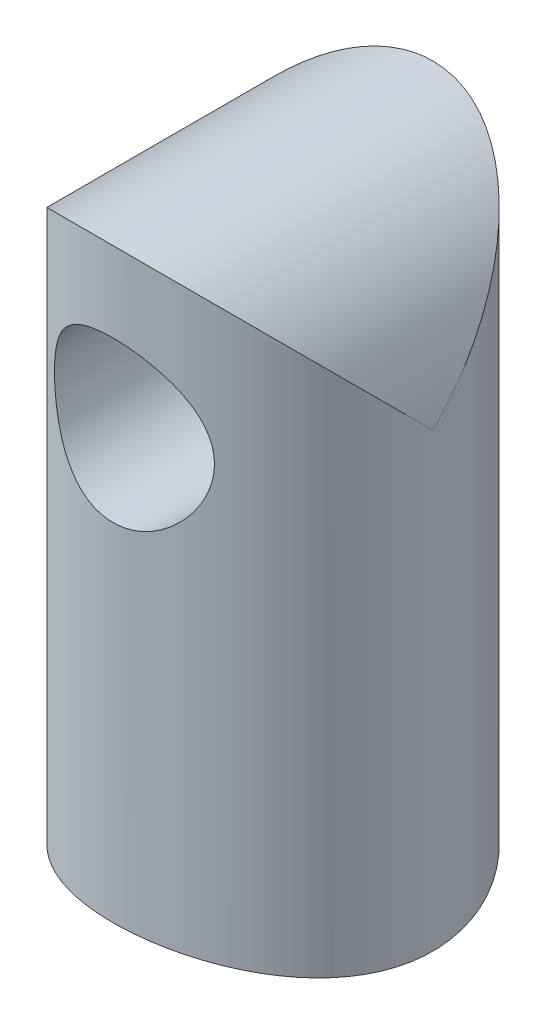
ISO-10303-21;
HEADER;
FILE_DESCRIPTION(('STEP AP214'),'2;1');
FILE_NAME('part.step','',(''),(''),'','','');
FILE_SCHEMA(('AUTOMOTIVE_DESIGN { 1 0 10303 214 1 1 1 1 }'));
ENDSEC;
DATA;
#1=APPLICATION_CONTEXT('core data for automotive mechanical design processes');
#2=APPLICATION_PROTOCOL_DEFINITION('international standard','automotive_design',2000,#1);
#3=PRODUCT_CONTEXT('',#1,'mechanical');
#4=PRODUCT('Part','Part','',(#3));
#5=PRODUCT_RELATED_PRODUCT_CATEGORY('part','',(#4));
#6=PRODUCT_DEFINITION_FORMATION('','',#4);
#7=PRODUCT_DEFINITION_CONTEXT('part definition',#1,'design');
#8=PRODUCT_DEFINITION('design','',#6,#7);
#9=PRODUCT_DEFINITION_SHAPE('','',#8);
#10=(LENGTH_UNIT() NAMED_UNIT(*) SI_UNIT(.MILLI.,.METRE.));
#11=(NAMED_UNIT(*) PLANE_ANGLE_UNIT() SI_UNIT($,.RADIAN.));
#12=(NAMED_UNIT(*) SI_UNIT($,.STERADIAN.) SOLID_ANGLE_UNIT());
#13=UNCERTAINTY_MEASURE_WITH_UNIT(LENGTH_MEASURE(1.E-05),#10,'distance_accuracy_value','');
#14=(GEOMETRIC_REPRESENTATION_CONTEXT(3) GLOBAL_UNCERTAINTY_ASSIGNED_CONTEXT((#13)) GLOBAL_UNIT_ASSIGNED_CONTEXT((#10,
#11,#12)) REPRESENTATION_CONTEXT('',''));
#15=CARTESIAN_POINT('',(0.,0.,0.));
#16=DIRECTION('',(0.,0.,1.));
#17=DIRECTION('',(1.,0.,0.));
#18=AXIS2_PLACEMENT_3D('',#15,#16,#17);
#19=CARTESIAN_POINT('',(0.,38.1,0.));
#20=DIRECTION('',(0.,-1.,0.));
#21=DIRECTION('',(0.,0.,-1.));
#22=AXIS2_PLACEMENT_3D('',#19,#20,#21);
#23=CYLINDRICAL_SURFACE('',#22,9.525);
#24=CARTESIAN_POINT('',(0.,1.462430355012,-9.525));
#25=CARTESIAN_POINT('',(-0.261276282805897,1.46243002752471,-9.5249994906273));
#26=CARTESIAN_POINT('',(-0.52256154392994,1.45919754412405,-9.51424070360328));
#27=CARTESIAN_POINT('',(-1.0432132540212,1.44635589434448,-9.47130246173066));
#28=CARTESIAN_POINT('',(-1.30257961489472,1.43674643702308,-9.43912202954257));
#29=CARTESIAN_POINT('',(-1.81756710219615,1.41141192069835,-9.35362083759131));
#30=CARTESIAN_POINT('',(-2.07318724769885,1.39568528862071,-9.30029463997786));
#31=CARTESIAN_POINT('',(-2.57879647271573,1.35854497033366,-9.17297110988262));
#32=CARTESIAN_POINT('',(-2.8287855933448,1.33713132566253,-9.09897392838274));
#33=CARTESIAN_POINT('',(-3.32100424883381,1.28923320386662,-8.93107280151393));
#34=CARTESIAN_POINT('',(-3.56324618379998,1.26275735790588,-8.83720271108593));
#35=CARTESIAN_POINT('',(-4.03890899254533,1.20539987672505,-8.63018795512074));
#36=CARTESIAN_POINT('',(-4.27232657571096,1.17451661807824,-8.5170361843746));
#37=CARTESIAN_POINT('',(-4.72874752480159,1.10915942483402,-8.27234036863639));
#38=CARTESIAN_POINT('',(-4.95175204605586,1.07468588995535,-8.14079837053922));
#39=CARTESIAN_POINT('',(-5.38602580755546,1.00303069315086,-7.8602281293437));
#40=CARTESIAN_POINT('',(-5.59729442127609,0.965848886887657,-7.71119895400683));
#41=CARTESIAN_POINT('',(-6.01212560267623,0.888743489308304,-7.39257246799982));
#42=CARTESIAN_POINT('',(-6.21534785061911,0.848773871031734,-7.22254309434725));
#43=CARTESIAN_POINT('',(-6.6068480403933,0.768058125757346,-6.86623941276072));
#44=CARTESIAN_POINT('',(-6.79512577226322,0.727311987859867,-6.67996487666923));
#45=CARTESIAN_POINT('',(-7.15558799282694,0.64613696645787,-6.29231655130381));
#46=CARTESIAN_POINT('',(-7.32776960697029,0.605708140797502,-6.09094007655518));
#47=CARTESIAN_POINT('',(-7.65488240263284,0.526284561932901,-5.67437499611286));
#48=CARTESIAN_POINT('',(-7.80981403348428,0.48728977139226,-5.45918675042219));
#49=CARTESIAN_POINT('',(-8.10470241847175,0.410965007055118,-5.01128135317639));
#50=CARTESIAN_POINT('',(-8.24423796824893,0.373693143036433,-4.77827667330229));
#51=CARTESIAN_POINT('',(-8.50306091050174,0.30292656433371,-4.30084664772239));
#52=CARTESIAN_POINT('',(-8.62235619272256,0.269430379590146,-4.05642579968977));
#53=CARTESIAN_POINT('',(-8.839798156981,0.207237555670709,-3.55774949820317));
#54=CARTESIAN_POINT('',(-8.93794447045742,0.178541000139498,-3.30349387345046));
#55=CARTESIAN_POINT('',(-9.11222470999036,0.126869909105711,-2.78698168743511));
#56=CARTESIAN_POINT('',(-9.18835942016625,0.103895169778911,-2.5247254115477));
#57=CARTESIAN_POINT('',(-9.31609536558913,0.0649788791724551,-2.00160990509204));
#58=CARTESIAN_POINT('',(-9.36832369777879,0.0488584535592795,-1.74091706736307));
#59=CARTESIAN_POINT('',(-9.45083093513903,0.0232562660705226,-1.21575655387324));
#60=CARTESIAN_POINT('',(-9.48111021570992,0.013774390654192,-0.951288942752189));
#61=CARTESIAN_POINT('',(-9.51942389460227,0.00175972313789774,-0.420645285112564));
#62=CARTESIAN_POINT('',(-9.52746296997447,-0.000774530025890904,-0.154469609598148));
#63=CARTESIAN_POINT('',(-9.52123033704243,0.00118545052819335,0.377591314893927));
#64=CARTESIAN_POINT('',(-9.50695910993148,0.00567953265745418,0.643476570011664));
#65=CARTESIAN_POINT('',(-9.45717039830513,0.0212586480105551,1.16328429656905));
#66=CARTESIAN_POINT('',(-9.42244382762791,0.0320982379354095,1.41729037583024));
#67=CARTESIAN_POINT('',(-9.33269760836814,0.0598430819830595,1.92144736821182));
#68=CARTESIAN_POINT('',(-9.27767072276701,0.0767504992147063,2.17159687329924));
#69=CARTESIAN_POINT('',(-9.14781567773668,0.116123597045211,2.66616613339961));
#70=CARTESIAN_POINT('',(-9.07299357735652,0.138587576718393,2.91058761680486));
#71=CARTESIAN_POINT('',(-8.90411473653491,0.188437106961217,3.39227496162094));
#72=CARTESIAN_POINT('',(-8.81005060956181,0.215824547033103,3.62953803484207));
#73=CARTESIAN_POINT('',(-8.60204933362897,0.275137867743401,4.09841687028367));
#74=CARTESIAN_POINT('',(-8.48786513549355,0.307119128423892,4.32991598231011));
#75=CARTESIAN_POINT('',(-8.24128020196169,0.374461182615543,4.78261364970794));
#76=CARTESIAN_POINT('',(-8.10887138619901,0.409823473060179,5.00380757745026));
#77=CARTESIAN_POINT('',(-7.82678126718384,0.482955491614975,5.43446213122859));
#78=CARTESIAN_POINT('',(-7.67710029919798,0.520725172989336,5.643922984896));
#79=CARTESIAN_POINT('',(-7.36142267105122,0.597675124895592,6.0498927684643));
#80=CARTESIAN_POINT('',(-7.19542554859226,0.636855435375976,6.24640133111436));
#81=CARTESIAN_POINT('',(-6.84083236063998,0.71726749343163,6.6332756847053));
#82=CARTESIAN_POINT('',(-6.65158000122028,0.758516293419886,6.8230369500041));
#83=CARTESIAN_POINT('',(-6.25775039910638,0.840287420307166,7.18594904551052));
#84=CARTESIAN_POINT('',(-6.05317853433732,0.880809996014073,7.35910565656526));
#85=CARTESIAN_POINT('',(-5.6298510119939,0.960048828601783,7.68779836494344));
#86=CARTESIAN_POINT('',(-5.41108893232353,0.998764253793297,7.84332639534066));
#87=CARTESIAN_POINT('',(-4.96095591609832,1.07328861740317,8.13550915906136));
#88=CARTESIAN_POINT('',(-4.72958999422632,1.10909869785494,8.27217132314722));
#89=CARTESIAN_POINT('',(-4.25404082889355,1.1770726876621,8.52654531418079));
#90=CARTESIAN_POINT('',(-4.00977975602352,1.20920955895627,8.64411899890857));
#91=CARTESIAN_POINT('',(-3.51161471166064,1.26863383437577,8.85819871222479));
#92=CARTESIAN_POINT('',(-3.2577106497332,1.29592119300742,8.95470454317582));
#93=CARTESIAN_POINT('',(-2.74214848334857,1.344852786304,9.12578744106896));
#94=CARTESIAN_POINT('',(-2.48049215003582,1.36649829904461,9.20036947500894));
#95=CARTESIAN_POINT('',(-1.95133824486523,1.40351912680127,9.32694493780772));
#96=CARTESIAN_POINT('',(-1.68384088669385,1.41889467079259,9.37893919156244));
#97=CARTESIAN_POINT('',(-1.15475477388174,1.44248917616383,9.45838996912571));
#98=CARTESIAN_POINT('',(-0.893298531062566,1.45094518689831,9.48666019490319));
#99=CARTESIAN_POINT('',(-0.368816900232286,1.46137148600439,9.52148449726262));
#100=CARTESIAN_POINT('',(-0.105791549943906,1.46334192967025,9.52803909381648));
#101=CARTESIAN_POINT('',(0.419834378174441,1.46074221735811,9.51937220280312));
#102=CARTESIAN_POINT('',(0.682435003443761,1.45617285082351,9.50415334358615));
#103=CARTESIAN_POINT('',(1.20528894236582,1.44062258868901,9.45208569015777));
#104=CARTESIAN_POINT('',(1.46554227260786,1.42964173843784,9.41523704893487));
#105=CARTESIAN_POINT('',(1.97589846871988,1.4018946442109,9.32133204051368));
#106=CARTESIAN_POINT('',(2.2260974436808,1.38526613015709,9.26475596410588));
#107=CARTESIAN_POINT('',(2.72081986131749,1.34660848186937,9.13172492725732));
#108=CARTESIAN_POINT('',(2.9653412356248,1.32457741223844,9.05526284231031));
#109=CARTESIAN_POINT('',(3.44693639320783,1.27569541077417,8.88310931395562));
#110=CARTESIAN_POINT('',(3.68401227617372,1.24884585239942,8.78742334918262));
#111=CARTESIAN_POINT('',(4.1493794894768,1.1909969925203,8.57749742397396));
#112=CARTESIAN_POINT('',(4.37766741116411,1.15999610127871,8.46325035204074));
#113=CARTESIAN_POINT('',(4.82904822955875,1.093889855907,8.21424708025427));
#114=CARTESIAN_POINT('',(5.0519053411619,1.05870726618265,8.0790839734919));
#115=CARTESIAN_POINT('',(5.48560434503355,0.985726179789717,7.79112048739206));
#116=CARTESIAN_POINT('',(5.69644078249998,0.947926512489902,7.63831219460214));
#117=CARTESIAN_POINT('',(6.10472288453188,0.870704208020991,7.31611979410175));
#118=CARTESIAN_POINT('',(6.30216856256306,0.831281572484013,7.14673570306029));
#119=CARTESIAN_POINT('',(6.68248956281669,0.751834046858156,6.79245915773239));
#120=CARTESIAN_POINT('',(6.86536460436444,0.71180914518545,6.60756640484282));
#121=CARTESIAN_POINT('',(7.22183886382722,0.630744851593996,6.21636779724186));
#122=CARTESIAN_POINT('',(7.39485443205955,0.589721876024945,6.00952618250054));
#123=CARTESIAN_POINT('',(7.72280853923807,0.509333326399805,5.58179670555396));
#124=CARTESIAN_POINT('',(7.87775364517641,0.469967153589419,5.36091399140022));
#125=CARTESIAN_POINT('',(8.1686010084386,0.394005711533406,4.90636424285183));
#126=CARTESIAN_POINT('',(8.30449573948792,0.357411540038209,4.67269220615881));
#127=CARTESIAN_POINT('',(8.55608774094582,0.288121533995326,4.19428161326064));
#128=CARTESIAN_POINT('',(8.67179334009023,0.255424093680363,3.94954767319527));
#129=CARTESIAN_POINT('',(8.88166259409212,0.195055703085415,3.45171480449464));
#130=CARTESIAN_POINT('',(8.97592049632123,0.167362876133364,3.19865829469703));
#131=CARTESIAN_POINT('',(9.1427386271818,0.117699867475509,2.68493682787122));
#132=CARTESIAN_POINT('',(9.21529884178507,0.0957296894695707,2.42427186592404));
#133=CARTESIAN_POINT('',(9.33803354838845,0.0582332468824251,1.89734325189772));
#134=CARTESIAN_POINT('',(9.38821446777648,0.0427051322144676,1.63108123034188));
#135=CARTESIAN_POINT('',(9.46573178290782,0.0186026272756182,1.09494349017593));
#136=CARTESIAN_POINT('',(9.49306904909949,0.0100279720462729,0.825067909657237));
#137=CARTESIAN_POINT('',(9.52397009537511,0.000327894031537148,0.29513269505229));
#138=CARTESIAN_POINT('',(9.52847776812818,-0.00109327479911402,0.0351330641183042));
#139=CARTESIAN_POINT('',(9.51622596423312,0.0027586195168968,-0.484309807535963));
#140=CARTESIAN_POINT('',(9.49946710903755,0.00803148704977546,-0.743753064292748));
#141=CARTESIAN_POINT('',(9.44484005147034,0.0251061017036068,-1.26017463106035));
#142=CARTESIAN_POINT('',(9.40697280768314,0.036907552345175,-1.51715305246646));
#143=CARTESIAN_POINT('',(9.31047328899498,0.0666744001527143,-2.02681529078472));
#144=CARTESIAN_POINT('',(9.2518409176834,0.0846398259374525,-2.27949908775161));
#145=CARTESIAN_POINT('',(9.11519361324661,0.125926799190357,-2.77565206372432));
#146=CARTESIAN_POINT('',(9.03743332174883,0.149177697431077,-3.01919738198007));
#147=CARTESIAN_POINT('',(8.86276266949509,0.200497197621339,-3.49889156224193));
#148=CARTESIAN_POINT('',(8.76584545705497,0.228567522818763,-3.73503774275352));
#149=CARTESIAN_POINT('',(8.55361521119089,0.288733655415763,-4.19835889187646));
#150=CARTESIAN_POINT('',(8.43830316452043,0.320829246868374,-4.42553434088945));
#151=CARTESIAN_POINT('',(8.19008623665933,0.388178401249212,-4.86958082372509));
#152=CARTESIAN_POINT('',(8.05718030716616,0.423432152310683,-5.08645124249231));
#153=CARTESIAN_POINT('',(7.76950531867906,0.497493877255533,-5.51631290228532));
#154=CARTESIAN_POINT('',(7.61411628143973,0.536384535725644,-5.72887518432289));
#155=CARTESIAN_POINT('',(7.28641847893187,0.615488606912841,-6.14026816535209));
#156=CARTESIAN_POINT('',(7.11410935671397,0.655702047523688,-6.33909857450269));
#157=CARTESIAN_POINT('',(6.75362134158311,0.736376167225122,-6.72185641673941));
#158=CARTESIAN_POINT('',(6.56543840246061,0.776836906899232,-6.90578002653843));
#159=CARTESIAN_POINT('',(6.17440941705494,0.856916073763125,-7.2575097585208));
#160=CARTESIAN_POINT('',(5.9715636285455,0.896534515744713,-7.4253161639248));
#161=CARTESIAN_POINT('',(5.54625641164809,0.975022346369634,-7.74842370253965));
#162=CARTESIAN_POINT('',(5.32339280580341,1.0138351427825,-7.9032097717848));
#163=CARTESIAN_POINT('',(4.86498047235606,1.08835041411965,-8.19335973714696));
#164=CARTESIAN_POINT('',(4.62943638902192,1.12405401542404,-8.32873067845201));
#165=CARTESIAN_POINT('',(4.14722418465391,1.19134834724708,-8.57904058756142));
#166=CARTESIAN_POINT('',(3.90055829975136,1.22293989960663,-8.69398363980058));
#167=CARTESIAN_POINT('',(3.39779711380564,1.28110920296748,-8.9025077224104));
#168=CARTESIAN_POINT('',(3.14170272546961,1.30768743775555,-8.99609081420741));
#169=CARTESIAN_POINT('',(2.6498777847451,1.35251445943209,-9.15221349903392));
#170=CARTESIAN_POINT('',(2.41491367045946,1.37135121966398,-9.21700755583859));
#171=CARTESIAN_POINT('',(1.94028860556357,1.40398078404708,-9.32846933574652));
#172=CARTESIAN_POINT('',(1.7006261415179,1.41777193381162,-9.37513111383464));
#173=CARTESIAN_POINT('',(1.21821096530279,1.43996976034882,-9.44992904397668));
#174=CARTESIAN_POINT('',(0.975458658109833,1.44837713549402,-9.47806759883962));
#175=CARTESIAN_POINT('',(0.488473130267296,1.4596065579164,-9.5155998649485));
#176=CARTESIAN_POINT('',(0.244240487971303,1.46243066114639,-9.52500047616047));
#177=CARTESIAN_POINT('',(0.,1.462430355012,-9.525));
#178=B_SPLINE_CURVE_WITH_KNOTS('',3,(#24,#25,#26,#27,#28,#29,#30,#31,#32,#33,#34,#35,#36,#37,
#38,#39,#40,#41,#42,#43,#44,#45,#46,#47,#48,#49,#50,#51,#52,#53,#54,#55,#56,#57,#58,#59,#60,#61,
#62,#63,#64,#65,#66,#67,#68,#69,#70,#71,#72,#73,#74,#75,#76,#77,#78,#79,#80,#81,#82,#83,#84,#85,
#86,#87,#88,#89,#90,#91,#92,#93,#94,#95,#96,#97,#98,#99,#100,#101,#102,#103,#104,#105,#106,#107,
#108,#109,#110,#111,#112,#113,#114,#115,#116,#117,#118,#119,#120,#121,#122,#123,#124,#125,#126,
#127,#128,#129,#130,#131,#132,#133,#134,#135,#136,#137,#138,#139,#140,#141,#142,#143,#144,#145,
#146,#147,#148,#149,#150,#151,#152,#153,#154,#155,#156,#157,#158,#159,#160,#161,#162,#163,#164,
#165,#166,#167,#168,#169,#170,#171,#172,#173,#174,#175,#176,#177),.UNSPECIFIED.,.T.,.F.,(4,2,2,
2,2,2,2,2,2,2,2,2,2,2,2,2,2,2,2,2,2,2,2,2,2,2,2,2,2,2,2,2,2,2,2,2,2,2,2,2,2,2,2,2,2,2,2,2,2,2,2,
2,2,2,2,2,2,2,2,2,2,2,2,2,2,2,2,2,2,2,2,2,2,2,2,2,4),(0.,0.783603987887818,1.56724372931363,
2.35108512255529,3.13492079072963,3.91743173125777,4.70023164943302,5.48294450857582,
6.26569911298454,7.0686855709993,7.87168330849091,8.67482417773021,9.47794412164215,
10.2993474087144,11.1204297698625,11.941526438783,12.7625938541708,13.5606774878366,
14.3587474713491,15.156649610293,15.9545345401532,16.7234251077824,17.4925900485423,
18.2615198300925,19.0307453402942,19.8101739666249,20.5899492931985,21.3697094862394,
22.1494917791935,22.9620210766534,23.7742664602417,24.5868820434442,25.3991766401844,
26.2171103045958,27.0350516417077,27.8528075251023,28.6705335418965,29.4589107341081,
30.247269048812,31.0355322060463,31.8237897879241,32.5940607194485,33.364607994912,
34.1349359819743,34.90555981136,35.6936878715637,36.482170771642,37.2706528788116,
38.0591501708695,38.876478010099,39.6935078922676,40.5108596560354,41.3278734317689,
42.1412245266079,42.9545761473017,43.7676940207634,44.5807809092771,45.3599592449981,
46.139114812018,46.9182349985275,47.6973588024691,48.4666240869389,49.2361650071023,
50.0056646606794,50.7752101842799,51.5727832932667,52.3703732316257,53.1681670922612,
53.9659469310441,54.7872657224762,55.6082857229186,56.4291413801616,57.2499177839975,
57.9825540142701,58.7154302511075,59.4482114014256,60.1807226662163),.UNSPECIFIED.);
#179=CARTESIAN_POINT('',(0.,1.462430355012,-9.525));
#180=VERTEX_POINT('',#179);
#181=EDGE_CURVE('E69',#180,#180,#178,.T.);
#182=ORIENTED_EDGE('',*,*,#181,.T.);
#183=EDGE_LOOP('',(#182));
#184=FACE_BOUND('',#183,.T.);
#185=CARTESIAN_POINT('',(4.76250000000001,26.862430355012,8.24889197104678));
#186=CARTESIAN_POINT('',(4.76249940729929,26.7382894519137,8.24889272394164));
#187=CARTESIAN_POINT('',(4.75763943059538,26.6141375048116,8.25170408952824));
#188=CARTESIAN_POINT('',(4.73826449608749,26.3667920096262,8.26284430339843));
#189=CARTESIAN_POINT('',(4.7237450433922,26.2435989347528,8.27117572034719));
#190=CARTESIAN_POINT('',(4.68521103701737,25.9989762104826,8.29306424044598));
#191=CARTESIAN_POINT('',(4.66118159277236,25.8775496376568,8.30662953786715));
#192=CARTESIAN_POINT('',(4.60393332228032,25.6374987200869,8.33849424083485));
#193=CARTESIAN_POINT('',(4.5707105000311,25.5188756182936,8.35679570478325));
#194=CARTESIAN_POINT('',(4.45820926505094,25.1697319298357,8.41767757563678));
#195=CARTESIAN_POINT('',(4.36584227707579,24.9443503195132,8.46639036631087));
#196=CARTESIAN_POINT('',(4.14940045989174,24.5124585930755,8.57453511094491));
#197=CARTESIAN_POINT('',(4.02532391532954,24.3059494987045,8.63396764474657));
#198=CARTESIAN_POINT('',(3.73698658313422,23.8987164916075,8.76284791263908));
#199=CARTESIAN_POINT('',(3.57025552600526,23.6998745303495,8.83271738343829));
#200=CARTESIAN_POINT('',(3.20633353614955,23.3314470834117,8.97122433178734));
#201=CARTESIAN_POINT('',(3.00912750204738,23.1618761912065,9.03986117960625));
#202=CARTESIAN_POINT('',(2.68636629044315,22.9274371816883,9.13908932048077));
#203=CARTESIAN_POINT('',(2.57020878007104,22.8505830776353,9.17251360649317));
#204=CARTESIAN_POINT('',(2.33097830003148,22.7070265511969,9.23620349246427));
#205=CARTESIAN_POINT('',(2.20790810968896,22.6403200882735,9.26647034811661));
#206=CARTESIAN_POINT('',(1.95564815668434,22.5177194947052,9.32297018211123));
#207=CARTESIAN_POINT('',(1.82645998115371,22.4618225787624,9.34920419923749));
#208=CARTESIAN_POINT('',(1.56285911383248,22.3614573124357,9.39686248352726));
#209=CARTESIAN_POINT('',(1.42844697872177,22.3169877481443,9.41828726153724));
#210=CARTESIAN_POINT('',(1.16519740858918,22.2427905793322,9.45432792849539));
#211=CARTESIAN_POINT('',(1.03664325296874,22.2122395256042,9.46931966688268));
#212=CARTESIAN_POINT('',(0.776963002287311,22.1618748317601,9.49415396935545));
#213=CARTESIAN_POINT('',(0.645837158923181,22.1420601462322,9.50399703476961));
#214=CARTESIAN_POINT('',(0.382159245593981,22.1134368893874,9.51824582475992));
#215=CARTESIAN_POINT('',(0.249607895282789,22.1046230053518,9.52265417396123));
#216=CARTESIAN_POINT('',(-0.0158324946519576,22.0981069524505,9.52591136422363));
#217=CARTESIAN_POINT('',(-0.148721513117992,22.1004041037544,9.52476054542327));
#218=CARTESIAN_POINT('',(-0.402105764472285,22.1153900040836,9.51727773119995));
#219=CARTESIAN_POINT('',(-0.522670621045652,22.127154490894,9.5114066080277));
#220=CARTESIAN_POINT('',(-0.762297504084288,22.159778378792,9.49520689673846));
#221=CARTESIAN_POINT('',(-0.881359043701561,22.1806406522059,9.48487690088979));
#222=CARTESIAN_POINT('',(-1.11709538585441,22.2312288681295,9.4600084221586));
#223=CARTESIAN_POINT('',(-1.23377097435057,22.2609518398717,9.44547134984976));
#224=CARTESIAN_POINT('',(-1.46405663273085,22.3289566962459,9.41253030003386));
#225=CARTESIAN_POINT('',(-1.57766550587512,22.3672418695462,9.39412483687505));
#226=CARTESIAN_POINT('',(-1.91586173980297,22.4955746039994,9.33315909327111));
#227=CARTESIAN_POINT('',(-2.13476891421779,22.598439288479,9.28518547508369));
#228=CARTESIAN_POINT('',(-2.55262754610699,22.8346218869908,9.1791264414455));
#229=CARTESIAN_POINT('',(-2.75157182236462,22.967950703711,9.12103740760328));
#230=CARTESIAN_POINT('',(-3.14406030579801,23.2757568142539,8.99371794927081));
#231=CARTESIAN_POINT('',(-3.33531640619752,23.45293241632,8.92395340854905));
#232=CARTESIAN_POINT('',(-3.68669670801986,23.8363275603849,8.78462733363277));
#233=CARTESIAN_POINT('',(-3.84679695689712,24.0425692399394,8.71506599580986));
#234=CARTESIAN_POINT('',(-4.06522723980458,24.3775438798934,8.61432292972857));
#235=CARTESIAN_POINT('',(-4.13613898270466,24.497424832463,8.58040455630013));
#236=CARTESIAN_POINT('',(-4.2674875647323,24.7436109623428,8.51583950077811));
#237=CARTESIAN_POINT('',(-4.32792911546944,24.8699132167821,8.48519134947438));
#238=CARTESIAN_POINT('',(-4.43772127646409,25.1281528642766,8.42829064611798));
#239=CARTESIAN_POINT('',(-4.48707578138171,25.2600882590783,8.40203655134897));
#240=CARTESIAN_POINT('',(-4.57409004971375,25.5286357375774,8.35498507502528));
#241=CARTESIAN_POINT('',(-4.61175703516625,25.6652448750598,8.334184324937));
#242=CARTESIAN_POINT('',(-4.67239107161607,25.9311554614617,8.30033105740273));
#243=CARTESIAN_POINT('',(-4.69628224178035,26.0601850492159,8.28679731609861));
#244=CARTESIAN_POINT('',(-4.73335209140224,26.3201975645226,8.26567972970449));
#245=CARTESIAN_POINT('',(-4.74653634178893,26.4511794401022,8.25809279049907));
#246=CARTESIAN_POINT('',(-4.76200330923098,26.7139503458874,8.24918359612277));
#247=CARTESIAN_POINT('',(-4.76429008560556,26.845739057226,8.24785900822164));
#248=CARTESIAN_POINT('',(-4.75793657566528,27.1089572711949,8.25152581127931));
#249=CARTESIAN_POINT('',(-4.74929702692112,27.2403867974714,8.25651677591304));
#250=CARTESIAN_POINT('',(-4.72277057816312,27.4873538885455,8.27171481492305));
#251=CARTESIAN_POINT('',(-4.7060027358946,27.6030524064208,8.2812892498129));
#252=CARTESIAN_POINT('',(-4.66412284465984,27.8324723898919,8.30494741203158));
#253=CARTESIAN_POINT('',(-4.63900817385685,27.9461932224475,8.3190325561764));
#254=CARTESIAN_POINT('',(-4.55152408813006,28.283284169842,8.36742301080679));
#255=CARTESIAN_POINT('',(-4.47699683650417,28.5027442180792,8.40787423037301));
#256=CARTESIAN_POINT('',(-4.29409140569222,28.9361116618979,8.50278882622772));
#257=CARTESIAN_POINT('',(-4.18430528181163,29.1492911215689,8.55781440671015));
#258=CARTESIAN_POINT('',(-3.93519108835804,29.5554695577047,8.67518529385013));
#259=CARTESIAN_POINT('',(-3.79584784304954,29.7484580910911,8.73753435328996));
#260=CARTESIAN_POINT('',(-3.47109765854161,30.1341644169681,8.87196405469708));
#261=CARTESIAN_POINT('',(-3.28209830684248,30.3237815259053,8.94428069402612));
#262=CARTESIAN_POINT('',(-2.87366994707529,30.6696514046863,9.08372577215842));
#263=CARTESIAN_POINT('',(-2.65423070130585,30.8258929043813,9.15085245356966));
#264=CARTESIAN_POINT('',(-2.30289806207734,31.0334368787686,9.24324496229829));
#265=CARTESIAN_POINT('',(-2.18030840919906,31.0988285050716,9.27299632526352));
#266=CARTESIAN_POINT('',(-1.92915304044621,31.218933439014,9.32847745043034));
#267=CARTESIAN_POINT('',(-1.80059000285164,31.2736514762294,9.35420899284426));
#268=CARTESIAN_POINT('',(-1.53844708260747,31.3717729128168,9.40087915370989));
#269=CARTESIAN_POINT('',(-1.40486962786039,31.4151817091266,9.4218200577416));
#270=CARTESIAN_POINT('',(-1.13371049467199,31.4901602499187,9.45827821966215));
#271=CARTESIAN_POINT('',(-0.996129293143723,31.5217313982924,9.47379612067972));
#272=CARTESIAN_POINT('',(-0.73094987320279,31.5702521245389,9.49775785076805));
#273=CARTESIAN_POINT('',(-0.603594424498008,31.5882777765291,9.50672024509144));
#274=CARTESIAN_POINT('',(-0.347590307680264,31.6139703691675,9.51951815365963));
#275=CARTESIAN_POINT('',(-0.218941740258939,31.6216381101586,9.52335406402124));
#276=CARTESIAN_POINT('',(0.0385649394422858,31.6265145312771,9.52579195912168));
#277=CARTESIAN_POINT('',(0.167422979823384,31.6237262553401,9.52439546710759));
#278=CARTESIAN_POINT('',(0.424324690613389,31.6077353032776,9.51641162435963));
#279=CARTESIAN_POINT('',(0.552368383343416,31.5945329138521,9.50982441652587));
#280=CARTESIAN_POINT('',(0.798199011861469,31.559095765367,9.49224229565679));
#281=CARTESIAN_POINT('',(0.916103849257605,31.5375167304109,9.48156800281864));
#282=CARTESIAN_POINT('',(1.14954398448084,31.4856623243624,9.45610870385304));
#283=CARTESIAN_POINT('',(1.26507851519123,31.4553841840498,9.44132238877766));
#284=CARTESIAN_POINT('',(1.60695881055025,31.3519360023435,9.39128133846021));
#285=CARTESIAN_POINT('',(1.8287887060402,31.2661217713675,9.35032881269076));
#286=CARTESIAN_POINT('',(2.26424000888416,31.0594861388241,9.25477034679552));
#287=CARTESIAN_POINT('',(2.47710454166773,30.9373244479216,9.1996553597058));
#288=CARTESIAN_POINT('',(2.88023067814637,30.6631050893237,9.08152237528229));
#289=CARTESIAN_POINT('',(3.07048183578566,30.511033690539,9.01850075296339));
#290=CARTESIAN_POINT('',(3.44287591291447,30.1638190045327,8.88342722741461));
#291=CARTESIAN_POINT('',(3.62232759996091,29.9658953505595,8.81110081200555));
#292=CARTESIAN_POINT('',(3.94652779549559,29.5415299170639,8.67074486013806));
#293=CARTESIAN_POINT('',(4.09124560184487,29.3150631752561,8.60271916402208));
#294=CARTESIAN_POINT('',(4.28094082941505,28.9539111224634,8.50907579729456));
#295=CARTESIAN_POINT('',(4.34031088280345,28.827793777393,8.47885685291068));
#296=CARTESIAN_POINT('',(4.44803619028847,28.570019525774,8.42284293524443));
#297=CARTESIAN_POINT('',(4.49639711741463,28.4383655139108,8.39704568515324));
#298=CARTESIAN_POINT('',(4.58140792637852,28.1707768547483,8.35096779630417));
#299=CARTESIAN_POINT('',(4.61808793582061,28.0348542295981,8.33067298601897));
#300=CARTESIAN_POINT('',(4.67935352294884,27.7595975874038,8.29641582497272));
#301=CARTESIAN_POINT('',(4.70394755663099,27.620266027289,8.28244904731641));
#302=CARTESIAN_POINT('',(4.73566148400959,27.3777348677118,8.26434282908568));
#303=CARTESIAN_POINT('',(4.74571628165859,27.275030289056,8.25856285278518));
#304=CARTESIAN_POINT('',(4.75913601002981,27.069029833879,8.25083698225998));
#305=CARTESIAN_POINT('',(4.76250049321452,26.9657339182648,8.24889134452707));
#306=CARTESIAN_POINT('',(4.76250000000001,26.862430355012,8.24889197104678));
#307=B_SPLINE_CURVE_WITH_KNOTS('',3,(#185,#186,#187,#188,#189,#190,#191,#192,#193,#194,#195,
#196,#197,#198,#199,#200,#201,#202,#203,#204,#205,#206,#207,#208,#209,#210,#211,#212,#213,#214,
#215,#216,#217,#218,#219,#220,#221,#222,#223,#224,#225,#226,#227,#228,#229,#230,#231,#232,#233,
#234,#235,#236,#237,#238,#239,#240,#241,#242,#243,#244,#245,#246,#247,#248,#249,#250,#251,#252,
#253,#254,#255,#256,#257,#258,#259,#260,#261,#262,#263,#264,#265,#266,#267,#268,#269,#270,#271,
#272,#273,#274,#275,#276,#277,#278,#279,#280,#281,#282,#283,#284,#285,#286,#287,#288,#289,#290,
#291,#292,#293,#294,#295,#296,#297,#298,#299,#300,#301,#302,#303,#304,#305,#306),.UNSPECIFIED.,
.T.,.F.,(4,2,2,2,2,2,2,2,2,2,2,2,2,2,2,2,2,2,2,2,2,2,2,2,2,2,2,2,2,2,2,2,2,2,2,2,2,2,2,2,2,2,2,
2,2,2,2,2,2,2,2,2,2,2,2,2,2,2,2,2,4),(0.,0.372315471290052,0.74480431525927,1.11787871748514,
1.49111553598562,2.23280682202777,2.97453823893685,3.77744614727717,4.5807532068975,
5.00998800301854,5.43905143864815,5.86800416968261,6.29691131496349,6.69531812541004,
7.09368613557449,7.49186168365561,7.8900128696135,8.25342137640538,8.6169447006213,
8.98034628149853,9.34388768226031,10.0802760151874,10.8169283051732,11.6232144167404,
12.4301179713144,12.8597106878863,13.2891095817441,13.7183573995584,14.1473394427285,
14.5425345752375,14.9375239513557,15.3323661820562,15.7271817607473,16.0786628916725,
16.4302545314545,17.1329551681528,17.8682015372252,18.6038263271151,19.432180208912,
20.2608133654722,20.6865967300835,21.1121909950174,21.5375817864789,21.9629221125511,
22.3492223853007,22.735492807399,23.1216507879208,23.5077981379075,23.8683853074205,
24.2290873914766,24.9498683654814,25.7014774099866,26.4534323155185,27.2802219250812,
28.1077396849723,28.5351353836895,28.9623103432981,29.3883744315651,29.8141399966485,
30.1239407256423,30.4337621775449),.UNSPECIFIED.);
#308=CARTESIAN_POINT('',(4.76250000000001,26.862430355012,8.24889197104678));
#309=VERTEX_POINT('',#308);
#310=EDGE_CURVE('E50',#309,#309,#307,.T.);
#311=ORIENTED_EDGE('',*,*,#310,.T.);
#312=EDGE_LOOP('',(#311));
#313=FACE_BOUND('',#312,.T.);
#314=CARTESIAN_POINT('',(0.,31.624930355012,-9.525));
#315=CARTESIAN_POINT('',(-0.125243167799989,31.6249299433262,-9.5249996206372));
#316=CARTESIAN_POINT('',(-0.250495089131836,31.6199842365529,-9.52252400598023));
#317=CARTESIAN_POINT('',(-0.500076393496527,31.6002578483703,-9.51268396387997));
#318=CARTESIAN_POINT('',(-0.624405351393147,31.5854728884318,-9.50531740964971));
#319=CARTESIAN_POINT('',(-0.871331001268149,31.5462150125598,-9.48587193787975));
#320=CARTESIAN_POINT('',(-0.993924963523298,31.52172828074,-9.47378630044847));
#321=CARTESIAN_POINT('',(-1.23637011508467,31.4633380893953,-9.44520637539277));
#322=CARTESIAN_POINT('',(-1.35622016139572,31.4294307802333,-9.42871028557932));
#323=CARTESIAN_POINT('',(-1.59183120722171,31.3527263504769,-9.39179697222459));
#324=CARTESIAN_POINT('',(-1.70760770137533,31.3099684672691,-9.37139708461428));
#325=CARTESIAN_POINT('',(-1.93495086483046,31.2158803751017,-9.3271126718355));
#326=CARTESIAN_POINT('',(-2.04651593025,31.1645469398109,-9.30322683559748));
#327=CARTESIAN_POINT('',(-2.37384489745524,30.9983762084413,-9.22716144615755));
#328=CARTESIAN_POINT('',(-2.58250225923313,30.8712830434667,-9.17053150857179));
#329=CARTESIAN_POINT('',(-2.98854538583361,30.5794613246628,-9.04666081910159));
#330=CARTESIAN_POINT('',(-3.18448556312959,30.4129210726629,-8.97898540114139));
#331=CARTESIAN_POINT('',(-3.5469969745544,30.0508392482799,-8.84205954293001));
#332=CARTESIAN_POINT('',(-3.71354582861884,29.8552757829388,-8.77280794740667));
#333=CARTESIAN_POINT('',(-4.02553537328567,29.4222977776272,-8.63435408613186));
#334=CARTESIAN_POINT('',(-4.16833749963763,29.1828138057556,-8.56557212539103));
#335=CARTESIAN_POINT('',(-4.35029005345508,28.8056084166393,-8.47379640254792));
#336=CARTESIAN_POINT('',(-4.40557901885787,28.676830180059,-8.4450962651909));
#337=CARTESIAN_POINT('',(-4.50483773649694,28.4140516658897,-8.39256904955604));
#338=CARTESIAN_POINT('',(-4.54881419057647,28.2800545345506,-8.36873908777994));
#339=CARTESIAN_POINT('',(-4.62261399582858,28.0159147457149,-8.32818911059645));
#340=CARTESIAN_POINT('',(-4.65312214328154,27.8860149331044,-8.31113119648638));
#341=CARTESIAN_POINT('',(-4.70318378391281,27.6235486678702,-8.28290506375683));
#342=CARTESIAN_POINT('',(-4.72274308921003,27.4909836688346,-8.27173372047612));
#343=CARTESIAN_POINT('',(-4.75061653464239,27.2243731005567,-8.25575723957705));
#344=CARTESIAN_POINT('',(-4.75893744712047,27.0903284720984,-8.25094826797975));
#345=CARTESIAN_POINT('',(-4.76421854927813,26.8219485356929,-8.2479001730778));
#346=CARTESIAN_POINT('',(-4.76117982286954,26.6876132567015,-8.24966042295241));
#347=CARTESIAN_POINT('',(-4.74483797280582,26.4359908919586,-8.25906842780931));
#348=CARTESIAN_POINT('',(-4.73280973448219,26.3185916222808,-8.2659846789569));
#349=CARTESIAN_POINT('',(-4.70015601149781,26.0853670292671,-8.28459407928506));
#350=CARTESIAN_POINT('',(-4.67952782662533,25.9695422120827,-8.29628872876442));
#351=CARTESIAN_POINT('',(-4.60506661909893,25.6256339499093,-8.33800444414717));
#352=CARTESIAN_POINT('',(-4.53864529577751,25.4009435764267,-8.37466460391199));
#353=CARTESIAN_POINT('',(-4.37297035741613,24.9610661275546,-8.46236620531704));
#354=CARTESIAN_POINT('',(-4.27298801966147,24.7462223199864,-8.51372273880603));
#355=CARTESIAN_POINT('',(-4.04355977442937,24.335292851099,-8.62505005190894));
#356=CARTESIAN_POINT('',(-3.91410063264099,24.1392156718392,-8.68502469635284));
#357=CARTESIAN_POINT('',(-3.61029947812719,23.7452754239773,-8.8160120789406));
#358=CARTESIAN_POINT('',(-3.43234782914613,23.5503383348677,-8.88746017331488));
#359=CARTESIAN_POINT('',(-3.04584295330871,23.1917815735419,-9.02721381532401));
#360=CARTESIAN_POINT('',(-2.83727518509306,23.0281768684514,-9.0955178493011));
#361=CARTESIAN_POINT('',(-2.49965137796344,22.8062650283748,-9.19195370403876));
#362=CARTESIAN_POINT('',(-2.38002127368373,22.7349123846945,-9.22372787983903));
#363=CARTESIAN_POINT('',(-2.13427687141612,22.6026521413299,-9.28366556941997));
#364=CARTESIAN_POINT('',(-2.00816533613018,22.5417401385517,-9.31183060399966));
#365=CARTESIAN_POINT('',(-1.75034069526616,22.4310203995298,-9.36371844925579));
#366=CARTESIAN_POINT('',(-1.61862987016266,22.3812081931968,-9.38744304755806));
#367=CARTESIAN_POINT('',(-1.3505610663951,22.2932641171903,-9.42974072645533));
#368=CARTESIAN_POINT('',(-1.21420362433566,22.2551309038388,-9.44831439964529));
#369=CARTESIAN_POINT('',(-0.949450109300051,22.1937196340943,-9.47841891468132));
#370=CARTESIAN_POINT('',(-0.821329961906905,22.1694728411407,-9.49040564136936));
#371=CARTESIAN_POINT('',(-0.56316406301835,22.1315456961969,-9.50921741531494));
#372=CARTESIAN_POINT('',(-0.433118482780762,22.1178644101425,-9.51604291885923));
#373=CARTESIAN_POINT('',(-0.172222200636561,22.1012513180539,-9.52433687415141));
#374=CARTESIAN_POINT('',(-0.0413718261918308,22.0983153966905,-9.52580737679103));
#375=CARTESIAN_POINT('',(0.220072847166306,22.1032217892018,-9.52335444060485));
#376=CARTESIAN_POINT('',(0.350667157156415,22.111063626076,-9.51943124049279));
#377=CARTESIAN_POINT('',(0.600383632816321,22.1363907918379,-9.50681651861088));
#378=CARTESIAN_POINT('',(0.719607798059647,22.1530783096676,-9.49851975936574));
#379=CARTESIAN_POINT('',(0.956123558476322,22.19534654109,-9.47763434053446));
#380=CARTESIAN_POINT('',(1.07341452918894,22.2209300715088,-9.46504432155853));
#381=CARTESIAN_POINT('',(1.30523272581462,22.2807174109142,-9.43586934009923));
#382=CARTESIAN_POINT('',(1.41976078572846,22.3149185820177,-9.41928560017321));
#383=CARTESIAN_POINT('',(1.64542419391326,22.3916126786724,-9.382499981618));
#384=CARTESIAN_POINT('',(1.75655822362735,22.4341087805254,-9.36229671724175));
#385=CARTESIAN_POINT('',(2.09007412634844,22.5761306410368,-9.29566539786794));
#386=CARTESIAN_POINT('',(2.3061103310862,22.6885189115622,-9.24405921515465));
#387=CARTESIAN_POINT('',(2.71685918550571,22.9434188190538,-9.13180205397676));
#388=CARTESIAN_POINT('',(2.91156269769227,23.0859432883597,-9.07114722574502));
#389=CARTESIAN_POINT('',(3.29452731372962,23.4132252497243,-8.93960783885979));
#390=CARTESIAN_POINT('',(3.48027815582499,23.6007556411562,-8.86830363142299));
#391=CARTESIAN_POINT('',(3.81886460963264,24.0046165416321,-8.72786114875583));
#392=CARTESIAN_POINT('',(3.97167745144759,24.2209668076204,-8.65872439991558));
#393=CARTESIAN_POINT('',(4.17638881115549,24.5692776193453,-8.56092960704943));
#394=CARTESIAN_POINT('',(4.24173741059432,24.6924933130146,-8.52864647367417));
#395=CARTESIAN_POINT('',(4.36167001930206,24.9449469860039,-8.46793790675362));
#396=CARTESIAN_POINT('',(4.41625890421415,25.07418220467,-8.43951072775551));
#397=CARTESIAN_POINT('',(4.51403084118841,25.3377417311593,-8.3876228681576));
#398=CARTESIAN_POINT('',(4.55722321448887,25.4720617766139,-8.36415813189979));
#399=CARTESIAN_POINT('',(4.63167416627274,25.7448535733026,-8.32316235190995));
#400=CARTESIAN_POINT('',(4.66293459251874,25.8833246781252,-8.30563038948562));
#401=CARTESIAN_POINT('',(4.71062527640278,26.1497364999243,-8.27866590076995));
#402=CARTESIAN_POINT('',(4.72819092555357,26.2774123636837,-8.26861751501085));
#403=CARTESIAN_POINT('',(4.75291664228842,26.5340895515387,-8.25443000373947));
#404=CARTESIAN_POINT('',(4.76007780009146,26.6630907353359,-8.25029025909993));
#405=CARTESIAN_POINT('',(4.76388567177541,26.9212538260789,-8.24809207938035));
#406=CARTESIAN_POINT('',(4.76053608147038,27.0504156605712,-8.25003150672726));
#407=CARTESIAN_POINT('',(4.74338307929259,27.3078055989573,-8.2599055190099));
#408=CARTESIAN_POINT('',(4.72958009537706,27.436033740859,-8.26783985851658));
#409=CARTESIAN_POINT('',(4.69353669139923,27.6783039475684,-8.28834856879423));
#410=CARTESIAN_POINT('',(4.67222934629288,27.7925299930538,-8.30040666790682));
#411=CARTESIAN_POINT('',(4.62147643847892,28.0186331390275,-8.32877048505191));
#412=CARTESIAN_POINT('',(4.59202835912459,28.1305095016026,-8.34507751652014));
#413=CARTESIAN_POINT('',(4.49189766535447,28.461598907157,-8.3996615585496));
#414=CARTESIAN_POINT('',(4.40940547807409,28.6764247854861,-8.44361545117));
#415=CARTESIAN_POINT('',(4.20916574352958,29.1038155810646,-8.54528603634261));
#416=CARTESIAN_POINT('',(4.08942191082136,29.3152588973918,-8.60372898549137));
#417=CARTESIAN_POINT('',(3.82024338512735,29.7164671694019,-8.72658246261696));
#418=CARTESIAN_POINT('',(3.67079324521366,29.9062207654925,-8.79099608593484));
#419=CARTESIAN_POINT('',(3.32520368388598,30.2825795902053,-8.92789150982251));
#420=CARTESIAN_POINT('',(3.12559766366326,30.4660007628881,-9.0004026516788));
#421=CARTESIAN_POINT('',(2.69626914168463,30.7975263911891,-9.13818513010387));
#422=CARTESIAN_POINT('',(2.46653050955161,30.9456118105627,-9.20345255422175));
#423=CARTESIAN_POINT('',(2.10268072495819,31.1378508248488,-9.29086610240478));
#424=CARTESIAN_POINT('',(1.97763300723183,31.1971312481466,-9.31834760006229));
#425=CARTESIAN_POINT('',(1.72211552262134,31.3048295437166,-9.36893044835914));
#426=CARTESIAN_POINT('',(1.59164845695407,31.3532527524424,-9.39203394996841));
#427=CARTESIAN_POINT('',(1.32654199767926,31.4385693850567,-9.43312646132604));
#428=CARTESIAN_POINT('',(1.19191242135595,31.4754879560828,-9.45112661821364));
#429=CARTESIAN_POINT('',(0.919388438520273,31.5374314154578,-9.48151473751691));
#430=CARTESIAN_POINT('',(0.781496080561081,31.562463569094,-9.49390612793915));
#431=CARTESIAN_POINT('',(0.536297175823778,31.5958548467409,-9.51048759454479));
#432=CARTESIAN_POINT('',(0.429411583767854,31.6067488004036,-9.51592021375586));
#433=CARTESIAN_POINT('',(0.215019489362881,31.6212868312952,-9.52317662911679));
#434=CARTESIAN_POINT('',(0.107512969957935,31.624930708417,-9.52500032565785));
#435=CARTESIAN_POINT('',(0.,31.624930355012,-9.525));
#436=B_SPLINE_CURVE_WITH_KNOTS('',3,(#314,#315,#316,#317,#318,#319,#320,#321,#322,#323,#324,
#325,#326,#327,#328,#329,#330,#331,#332,#333,#334,#335,#336,#337,#338,#339,#340,#341,#342,#343,
#344,#345,#346,#347,#348,#349,#350,#351,#352,#353,#354,#355,#356,#357,#358,#359,#360,#361,#362,
#363,#364,#365,#366,#367,#368,#369,#370,#371,#372,#373,#374,#375,#376,#377,#378,#379,#380,#381,
#382,#383,#384,#385,#386,#387,#388,#389,#390,#391,#392,#393,#394,#395,#396,#397,#398,#399,#400,
#401,#402,#403,#404,#405,#406,#407,#408,#409,#410,#411,#412,#413,#414,#415,#416,#417,#418,#419,
#420,#421,#422,#423,#424,#425,#426,#427,#428,#429,#430,#431,#432,#433,#434,#435),.UNSPECIFIED.,
.T.,.F.,(4,2,2,2,2,2,2,2,2,2,2,2,2,2,2,2,2,2,2,2,2,2,2,2,2,2,2,2,2,2,2,2,2,2,2,2,2,2,2,2,2,2,2,
2,2,2,2,2,2,2,2,2,2,2,2,2,2,2,2,2,4),(0.,0.375623418154021,0.751410280296023,1.12773421934006,
1.50421216665562,1.87905550525341,2.25404018794787,3.00318908218551,3.7976597983107,
4.59273287924314,5.4494638936804,5.8781190538996,6.30651967909289,6.70950847539315,
7.11228314445237,7.51481498990845,7.91730842763879,8.27152461989833,8.62585211283934,
9.33399259637595,10.0586277474397,10.7835888844336,11.6004728904415,12.417746144678,
12.8458801890468,13.2738332313566,13.701613616489,14.1293447666274,14.521651524315,
14.913923595397,15.3060454158579,15.698149882404,16.0597456619957,16.4214560413944,
16.7830558344937,17.144794364286,17.8882174899416,18.6319578135026,19.4487341785404,
20.2660733794108,20.6950689367829,21.1238696504806,21.5523185520335,21.9807010777177,
22.3679690015927,22.7551963432537,23.1422875423821,23.5293628950278,23.8794231642634,
24.2295917732494,24.9294696536929,25.6763690993088,26.4236579446131,27.2617475314397,
28.1002876036314,28.5230685284025,28.9456411934233,29.3672836019069,29.7886679587935,
30.1111069020891,30.4335547448008),.UNSPECIFIED.);
#437=CARTESIAN_POINT('',(0.,31.624930355012,-9.525));
#438=VERTEX_POINT('',#437);
#439=EDGE_CURVE('E48',#438,#438,#436,.T.);
#440=ORIENTED_EDGE('',*,*,#439,.T.);
#441=EDGE_LOOP('',(#440));
#442=FACE_BOUND('',#441,.T.);
#443=CARTESIAN_POINT('',(0.,26.862430355012,0.));
#444=DIRECTION('',(0.,-0.707106781186547,0.707106781186548));
#445=DIRECTION('',(0.,-0.707106781186547,-0.707106781186548));
#446=AXIS2_PLACEMENT_3D('',#443,#444,#445);
#447=ELLIPSE('',#446,13.4703841816037,9.525);
#448=CARTESIAN_POINT('',(9.525,26.862430355012,0.));
#449=VERTEX_POINT('',#448);
#450=CARTESIAN_POINT('',(-9.525,26.862430355012,0.));
#451=VERTEX_POINT('',#450);
#452=EDGE_CURVE('E40',#449,#451,#447,.T.);
#453=ORIENTED_EDGE('',*,*,#452,.T.);
#454=CARTESIAN_POINT('',(0.,26.862430355012,0.));
#455=DIRECTION('',(0.,-0.707106781186547,-0.707106781186548));
#456=DIRECTION('',(0.,-0.707106781186547,0.707106781186548));
#457=AXIS2_PLACEMENT_3D('',#454,#455,#456);
#458=ELLIPSE('',#457,13.4703841816037,9.525);
#459=EDGE_CURVE('E11',#451,#449,#458,.T.);
#460=ORIENTED_EDGE('',*,*,#459,.T.);
#461=EDGE_LOOP('',(#453,#460));
#462=FACE_BOUND('',#461,.T.);
#463=ADVANCED_FACE('F32',(#184,#313,#442,#462),#23,.T.);
#464=CARTESIAN_POINT('',(0.,-30.287569644988,-9.525));
#465=DIRECTION('',(0.,0.,1.));
#466=DIRECTION('',(1.,0.,0.));
#467=AXIS2_PLACEMENT_3D('',#464,#465,#466);
#468=CYLINDRICAL_SURFACE('',#467,31.75);
#469=ORIENTED_EDGE('',*,*,#181,.F.);
#470=EDGE_LOOP('',(#469));
#471=FACE_BOUND('',#470,.T.);
#472=ADVANCED_FACE('F63',(#471),#468,.F.);
#473=CARTESIAN_POINT('',(0.,26.862430355012,-9.525));
#474=DIRECTION('',(0.,0.,1.));
#475=DIRECTION('',(1.,0.,0.));
#476=AXIS2_PLACEMENT_3D('',#473,#474,#475);
#477=CYLINDRICAL_SURFACE('',#476,4.76250000000001);
#478=ORIENTED_EDGE('',*,*,#310,.F.);
#479=EDGE_LOOP('',(#478));
#480=FACE_BOUND('',#479,.T.);
#481=ORIENTED_EDGE('',*,*,#439,.F.);
#482=EDGE_LOOP('',(#481));
#483=FACE_BOUND('',#482,.T.);
#484=ADVANCED_FACE('F59',(#480,#483),#477,.F.);
#485=CARTESIAN_POINT('',(0.,26.862430355012,-9.525));
#486=DIRECTION('',(0.,0.,1.));
#487=DIRECTION('',(1.,0.,0.));
#488=AXIS2_PLACEMENT_3D('',#485,#486,#487);
#489=CYLINDRICAL_SURFACE('',#488,9.525);
#490=ORIENTED_EDGE('',*,*,#459,.F.);
#491=ORIENTED_EDGE('',*,*,#452,.F.);
#492=EDGE_LOOP('',(#490,#491));
#493=FACE_BOUND('',#492,.T.);
#494=ADVANCED_FACE('F46',(#493),#489,.T.);
#495=CLOSED_SHELL('',(#463,#472,#484,#494));
#496=MANIFOLD_SOLID_BREP('B2',#495);
#497=ADVANCED_BREP_SHAPE_REPRESENTATION('',(#18,#496),#14);
#498=SHAPE_DEFINITION_REPRESENTATION(#9,#497);
ENDSEC;
END-ISO-10303-21;
